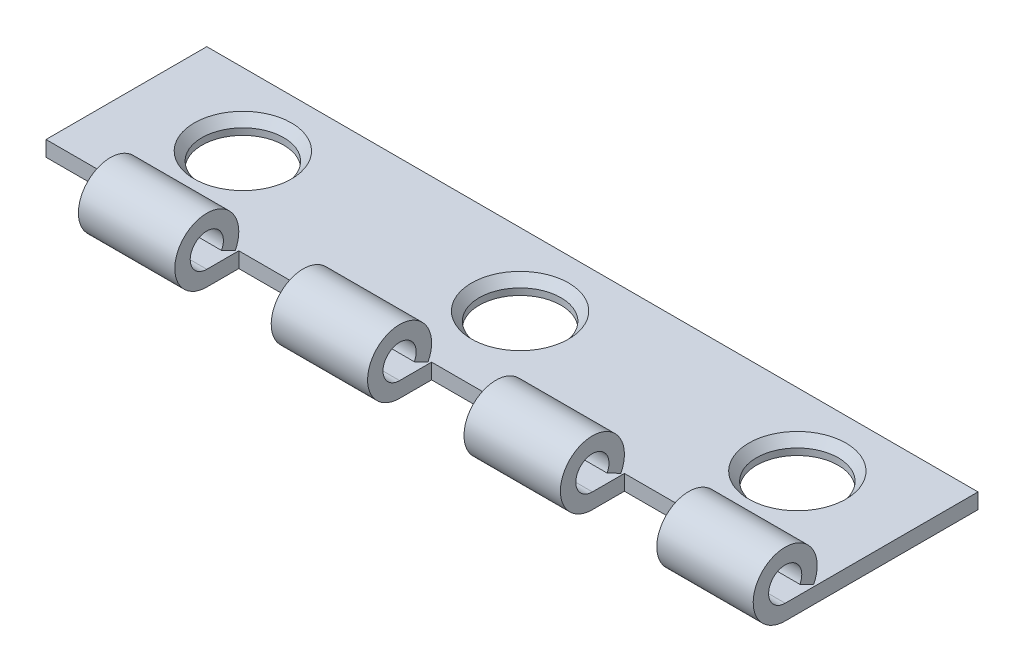
ISO-10303-21;
HEADER;
FILE_DESCRIPTION(('STEP AP214'),'2;1');
FILE_NAME('part.step','',(''),(''),'','','');
FILE_SCHEMA(('AUTOMOTIVE_DESIGN { 1 0 10303 214 1 1 1 1 }'));
ENDSEC;
DATA;
#1=APPLICATION_CONTEXT('core data for automotive mechanical design processes');
#2=APPLICATION_PROTOCOL_DEFINITION('international standard','automotive_design',2000,#1);
#3=PRODUCT_CONTEXT('',#1,'mechanical');
#4=PRODUCT('Part','Part','',(#3));
#5=PRODUCT_RELATED_PRODUCT_CATEGORY('part','',(#4));
#6=PRODUCT_DEFINITION_FORMATION('','',#4);
#7=PRODUCT_DEFINITION_CONTEXT('part definition',#1,'design');
#8=PRODUCT_DEFINITION('design','',#6,#7);
#9=PRODUCT_DEFINITION_SHAPE('','',#8);
#10=(LENGTH_UNIT() NAMED_UNIT(*) SI_UNIT(.MILLI.,.METRE.));
#11=(NAMED_UNIT(*) PLANE_ANGLE_UNIT() SI_UNIT($,.RADIAN.));
#12=(NAMED_UNIT(*) SI_UNIT($,.STERADIAN.) SOLID_ANGLE_UNIT());
#13=UNCERTAINTY_MEASURE_WITH_UNIT(LENGTH_MEASURE(1.E-05),#10,'distance_accuracy_value','');
#14=(GEOMETRIC_REPRESENTATION_CONTEXT(3) GLOBAL_UNCERTAINTY_ASSIGNED_CONTEXT((#13)) GLOBAL_UNIT_ASSIGNED_CONTEXT((#10,
#11,#12)) REPRESENTATION_CONTEXT('',''));
#15=CARTESIAN_POINT('',(0.,0.,0.));
#16=DIRECTION('',(0.,0.,1.));
#17=DIRECTION('',(1.,0.,0.));
#18=AXIS2_PLACEMENT_3D('',#15,#16,#17);
#19=CARTESIAN_POINT('',(-25.4,0.,0.));
#20=DIRECTION('',(1.,0.,0.));
#21=DIRECTION('',(0.,0.,-1.));
#22=AXIS2_PLACEMENT_3D('',#19,#20,#21);
#23=CYLINDRICAL_SURFACE('',#22,1.0922);
#24=DIRECTION('',(1.,0.,0.));
#25=VECTOR('',#24,1.);
#26=CARTESIAN_POINT('',(-25.4,-0.502417325814915,-0.969782280061349));
#27=LINE('',#26,#25);
#28=CARTESIAN_POINT('',(-6.35,-0.502417325814915,-0.969782280061349));
#29=VERTEX_POINT('',#28);
#30=CARTESIAN_POINT('',(0.,-0.502417325814915,-0.969782280061349));
#31=VERTEX_POINT('',#30);
#32=EDGE_CURVE('E384',#29,#31,#27,.T.);
#33=ORIENTED_EDGE('',*,*,#32,.T.);
#34=CARTESIAN_POINT('',(0.,0.,0.));
#35=DIRECTION('',(-1.,0.,0.));
#36=DIRECTION('',(0.,0.,1.));
#37=AXIS2_PLACEMENT_3D('',#34,#35,#36);
#38=CIRCLE('',#37,1.0922);
#39=CARTESIAN_POINT('',(0.,-1.0922,0.));
#40=VERTEX_POINT('',#39);
#41=EDGE_CURVE('E316',#31,#40,#38,.F.);
#42=ORIENTED_EDGE('',*,*,#41,.T.);
#43=DIRECTION('',(1.,0.,0.));
#44=VECTOR('',#43,1.);
#45=CARTESIAN_POINT('',(-25.4,-1.0922,0.));
#46=LINE('',#45,#44);
#47=CARTESIAN_POINT('',(-6.35,-1.0922,0.));
#48=VERTEX_POINT('',#47);
#49=EDGE_CURVE('E403',#48,#40,#46,.T.);
#50=ORIENTED_EDGE('',*,*,#49,.F.);
#51=CARTESIAN_POINT('',(-6.35,0.,0.));
#52=DIRECTION('',(1.,0.,0.));
#53=DIRECTION('',(0.,0.,-1.));
#54=AXIS2_PLACEMENT_3D('',#51,#52,#53);
#55=CIRCLE('',#54,1.0922);
#56=EDGE_CURVE('E280',#48,#29,#55,.F.);
#57=ORIENTED_EDGE('',*,*,#56,.T.);
#58=EDGE_LOOP('',(#33,#42,#50,#57));
#59=FACE_BOUND('',#58,.T.);
#60=ADVANCED_FACE('F41',(#59),#23,.F.);
#61=CARTESIAN_POINT('',(-19.05,-0.502417325814915,-0.969782280061349));
#62=VERTEX_POINT('',#61);
#63=CARTESIAN_POINT('',(-12.7,-0.502417325814915,-0.969782280061349));
#64=VERTEX_POINT('',#63);
#65=EDGE_CURVE('E482',#62,#64,#27,.T.);
#66=ORIENTED_EDGE('',*,*,#65,.T.);
#67=CARTESIAN_POINT('',(-12.7,0.,0.));
#68=DIRECTION('',(-1.,0.,0.));
#69=DIRECTION('',(0.,0.,1.));
#70=AXIS2_PLACEMENT_3D('',#67,#68,#69);
#71=CIRCLE('',#70,1.0922);
#72=CARTESIAN_POINT('',(-12.7,-1.0922,0.));
#73=VERTEX_POINT('',#72);
#74=EDGE_CURVE('E294',#64,#73,#71,.F.);
#75=ORIENTED_EDGE('',*,*,#74,.T.);
#76=CARTESIAN_POINT('',(-19.05,-1.0922,0.));
#77=VERTEX_POINT('',#76);
#78=EDGE_CURVE('E408',#77,#73,#46,.T.);
#79=ORIENTED_EDGE('',*,*,#78,.F.);
#80=CARTESIAN_POINT('',(-19.05,0.,0.));
#81=DIRECTION('',(1.,0.,0.));
#82=DIRECTION('',(0.,0.,-1.));
#83=AXIS2_PLACEMENT_3D('',#80,#81,#82);
#84=CIRCLE('',#83,1.0922);
#85=EDGE_CURVE('E269',#77,#62,#84,.F.);
#86=ORIENTED_EDGE('',*,*,#85,.T.);
#87=EDGE_LOOP('',(#66,#75,#79,#86));
#88=FACE_BOUND('',#87,.T.);
#89=ADVANCED_FACE('F508',(#88),#23,.F.);
#90=CARTESIAN_POINT('',(-25.4,0.,0.));
#91=DIRECTION('',(1.,0.,0.));
#92=DIRECTION('',(0.,0.,-1.));
#93=AXIS2_PLACEMENT_3D('',#90,#91,#92);
#94=CYLINDRICAL_SURFACE('',#93,2.10820000000008);
#95=CARTESIAN_POINT('',(0.,0.,0.));
#96=DIRECTION('',(-1.,0.,0.));
#97=DIRECTION('',(0.,0.,1.));
#98=AXIS2_PLACEMENT_3D('',#95,#96,#97);
#99=CIRCLE('',#98,2.10820000000008);
#100=CARTESIAN_POINT('',(0.,-2.1082,0.));
#101=VERTEX_POINT('',#100);
#102=CARTESIAN_POINT('',(0.,-0.969782280061348,-1.87190533128121));
#103=VERTEX_POINT('',#102);
#104=EDGE_CURVE('E230',#101,#103,#99,.T.);
#105=ORIENTED_EDGE('',*,*,#104,.T.);
#106=DIRECTION('',(1.,0.,0.));
#107=VECTOR('',#106,1.);
#108=CARTESIAN_POINT('',(-25.4,-0.969782280061348,-1.87190533128121));
#109=LINE('',#108,#107);
#110=CARTESIAN_POINT('',(-6.35,-0.969782280061348,-1.87190533128121));
#111=VERTEX_POINT('',#110);
#112=EDGE_CURVE('E387',#111,#103,#109,.T.);
#113=ORIENTED_EDGE('',*,*,#112,.F.);
#114=CARTESIAN_POINT('',(-6.35,0.,0.));
#115=DIRECTION('',(1.,0.,0.));
#116=DIRECTION('',(0.,0.,-1.));
#117=AXIS2_PLACEMENT_3D('',#114,#115,#116);
#118=CIRCLE('',#117,2.10820000000008);
#119=CARTESIAN_POINT('',(-6.35,-2.1082,0.));
#120=VERTEX_POINT('',#119);
#121=EDGE_CURVE('E286',#111,#120,#118,.T.);
#122=ORIENTED_EDGE('',*,*,#121,.T.);
#123=DIRECTION('',(1.,0.,0.));
#124=VECTOR('',#123,1.);
#125=CARTESIAN_POINT('',(-25.4,-2.1082,0.));
#126=LINE('',#125,#124);
#127=EDGE_CURVE('E391',#120,#101,#126,.T.);
#128=ORIENTED_EDGE('',*,*,#127,.T.);
#129=EDGE_LOOP('',(#105,#113,#122,#128));
#130=FACE_BOUND('',#129,.T.);
#131=ADVANCED_FACE('F526',(#130),#94,.T.);
#132=CARTESIAN_POINT('',(-12.7,0.,0.));
#133=DIRECTION('',(-1.,0.,0.));
#134=DIRECTION('',(0.,0.,1.));
#135=AXIS2_PLACEMENT_3D('',#132,#133,#134);
#136=CIRCLE('',#135,2.10820000000008);
#137=CARTESIAN_POINT('',(-12.7,-2.1082,0.));
#138=VERTEX_POINT('',#137);
#139=CARTESIAN_POINT('',(-12.7,-0.969782280061348,-1.87190533128121));
#140=VERTEX_POINT('',#139);
#141=EDGE_CURVE('E300',#138,#140,#136,.T.);
#142=ORIENTED_EDGE('',*,*,#141,.T.);
#143=CARTESIAN_POINT('',(-19.05,-0.969782280061348,-1.87190533128121));
#144=VERTEX_POINT('',#143);
#145=EDGE_CURVE('E490',#144,#140,#109,.T.);
#146=ORIENTED_EDGE('',*,*,#145,.F.);
#147=CARTESIAN_POINT('',(-19.05,0.,0.));
#148=DIRECTION('',(1.,0.,0.));
#149=DIRECTION('',(0.,0.,-1.));
#150=AXIS2_PLACEMENT_3D('',#147,#148,#149);
#151=CIRCLE('',#150,2.10820000000008);
#152=CARTESIAN_POINT('',(-19.05,-2.1082,0.));
#153=VERTEX_POINT('',#152);
#154=EDGE_CURVE('E275',#144,#153,#151,.T.);
#155=ORIENTED_EDGE('',*,*,#154,.T.);
#156=EDGE_CURVE('E397',#153,#138,#126,.T.);
#157=ORIENTED_EDGE('',*,*,#156,.T.);
#158=EDGE_LOOP('',(#142,#146,#155,#157));
#159=FACE_BOUND('',#158,.T.);
#160=ADVANCED_FACE('F528',(#159),#94,.T.);
#161=CARTESIAN_POINT('',(6.35,-0.969782280061348,-1.87190533128121));
#162=VERTEX_POINT('',#161);
#163=CARTESIAN_POINT('',(12.7,-0.969782280061348,-1.87190533128121));
#164=VERTEX_POINT('',#163);
#165=EDGE_CURVE('E385',#162,#164,#109,.T.);
#166=ORIENTED_EDGE('',*,*,#165,.F.);
#167=CARTESIAN_POINT('',(6.35,0.,0.));
#168=DIRECTION('',(1.,0.,0.));
#169=DIRECTION('',(0.,0.,-1.));
#170=AXIS2_PLACEMENT_3D('',#167,#168,#169);
#171=CIRCLE('',#170,2.10820000000008);
#172=CARTESIAN_POINT('',(6.35,-2.1082,0.));
#173=VERTEX_POINT('',#172);
#174=EDGE_CURVE('E311',#162,#173,#171,.T.);
#175=ORIENTED_EDGE('',*,*,#174,.T.);
#176=CARTESIAN_POINT('',(12.7,-2.1082,0.));
#177=VERTEX_POINT('',#176);
#178=EDGE_CURVE('E389',#173,#177,#126,.T.);
#179=ORIENTED_EDGE('',*,*,#178,.T.);
#180=CARTESIAN_POINT('',(12.7,0.,0.));
#181=DIRECTION('',(-1.,0.,0.));
#182=DIRECTION('',(0.,0.,1.));
#183=AXIS2_PLACEMENT_3D('',#180,#181,#182);
#184=CIRCLE('',#183,2.10820000000008);
#185=EDGE_CURVE('E347',#177,#164,#184,.T.);
#186=ORIENTED_EDGE('',*,*,#185,.T.);
#187=EDGE_LOOP('',(#166,#175,#179,#186));
#188=FACE_BOUND('',#187,.T.);
#189=ADVANCED_FACE('F578',(#188),#94,.T.);
#190=CARTESIAN_POINT('',(-25.4,-0.502417325814915,-0.969782280061349));
#191=DIRECTION('',(0.,0.887916388995925,-0.460004876226804));
#192=DIRECTION('',(0.,-0.460004876226804,-0.887916388995925));
#193=AXIS2_PLACEMENT_3D('',#190,#191,#192);
#194=PLANE('',#193);
#195=ORIENTED_EDGE('',*,*,#112,.T.);
#196=DIRECTION('',(0.,0.460004876226804,0.887916388995925));
#197=VECTOR('',#196,1.);
#198=CARTESIAN_POINT('',(0.,-0.502417325814915,-0.969782280061349));
#199=LINE('',#198,#197);
#200=EDGE_CURVE('E319',#103,#31,#199,.T.);
#201=ORIENTED_EDGE('',*,*,#200,.T.);
#202=ORIENTED_EDGE('',*,*,#32,.F.);
#203=DIRECTION('',(0.,-0.460004876226804,-0.887916388995925));
#204=VECTOR('',#203,1.);
#205=CARTESIAN_POINT('',(-6.35,-0.502417325814915,-0.969782280061349));
#206=LINE('',#205,#204);
#207=EDGE_CURVE('E283',#29,#111,#206,.T.);
#208=ORIENTED_EDGE('',*,*,#207,.T.);
#209=EDGE_LOOP('',(#195,#201,#202,#208));
#210=FACE_BOUND('',#209,.T.);
#211=ADVANCED_FACE('F523',(#210),#194,.F.);
#212=ORIENTED_EDGE('',*,*,#145,.T.);
#213=DIRECTION('',(0.,0.460004876226804,0.887916388995925));
#214=VECTOR('',#213,1.);
#215=CARTESIAN_POINT('',(-12.7,-0.502417325814915,-0.969782280061349));
#216=LINE('',#215,#214);
#217=EDGE_CURVE('E297',#140,#64,#216,.T.);
#218=ORIENTED_EDGE('',*,*,#217,.T.);
#219=ORIENTED_EDGE('',*,*,#65,.F.);
#220=DIRECTION('',(0.,-0.460004876226804,-0.887916388995925));
#221=VECTOR('',#220,1.);
#222=CARTESIAN_POINT('',(-19.05,-0.502417325814915,-0.969782280061349));
#223=LINE('',#222,#221);
#224=EDGE_CURVE('E272',#62,#144,#223,.T.);
#225=ORIENTED_EDGE('',*,*,#224,.T.);
#226=EDGE_LOOP('',(#212,#218,#219,#225));
#227=FACE_BOUND('',#226,.T.);
#228=ADVANCED_FACE('F516',(#227),#194,.F.);
#229=CARTESIAN_POINT('',(6.35,-1.0922,0.));
#230=VERTEX_POINT('',#229);
#231=CARTESIAN_POINT('',(12.7,-1.0922,0.));
#232=VERTEX_POINT('',#231);
#233=EDGE_CURVE('E401',#230,#232,#46,.T.);
#234=ORIENTED_EDGE('',*,*,#233,.F.);
#235=CARTESIAN_POINT('',(6.35,0.,0.));
#236=DIRECTION('',(1.,0.,0.));
#237=DIRECTION('',(0.,0.,-1.));
#238=AXIS2_PLACEMENT_3D('',#235,#236,#237);
#239=CIRCLE('',#238,1.0922);
#240=CARTESIAN_POINT('',(6.35,-0.502417325814915,-0.969782280061349));
#241=VERTEX_POINT('',#240);
#242=EDGE_CURVE('E305',#230,#241,#239,.F.);
#243=ORIENTED_EDGE('',*,*,#242,.T.);
#244=CARTESIAN_POINT('',(12.7,-0.502417325814915,-0.969782280061349));
#245=VERTEX_POINT('',#244);
#246=EDGE_CURVE('E382',#241,#245,#27,.T.);
#247=ORIENTED_EDGE('',*,*,#246,.T.);
#248=CARTESIAN_POINT('',(12.7,0.,0.));
#249=DIRECTION('',(-1.,0.,0.));
#250=DIRECTION('',(0.,0.,1.));
#251=AXIS2_PLACEMENT_3D('',#248,#249,#250);
#252=CIRCLE('',#251,1.0922);
#253=EDGE_CURVE('E346',#245,#232,#252,.F.);
#254=ORIENTED_EDGE('',*,*,#253,.T.);
#255=EDGE_LOOP('',(#234,#243,#247,#254));
#256=FACE_BOUND('',#255,.T.);
#257=ADVANCED_FACE('F547',(#256),#23,.F.);
#258=ORIENTED_EDGE('',*,*,#246,.F.);
#259=DIRECTION('',(0.,-0.460004876226804,-0.887916388995925));
#260=VECTOR('',#259,1.);
#261=CARTESIAN_POINT('',(6.35,-0.502417325814915,-0.969782280061349));
#262=LINE('',#261,#260);
#263=EDGE_CURVE('E308',#241,#162,#262,.T.);
#264=ORIENTED_EDGE('',*,*,#263,.T.);
#265=ORIENTED_EDGE('',*,*,#165,.T.);
#266=DIRECTION('',(0.,0.460004876226804,0.887916388995925));
#267=VECTOR('',#266,1.);
#268=CARTESIAN_POINT('',(12.7,-0.502417325814915,-0.969782280061349));
#269=LINE('',#268,#267);
#270=EDGE_CURVE('E407',#164,#245,#269,.T.);
#271=ORIENTED_EDGE('',*,*,#270,.T.);
#272=EDGE_LOOP('',(#258,#264,#265,#271));
#273=FACE_BOUND('',#272,.T.);
#274=ADVANCED_FACE('F549',(#273),#194,.F.);
#275=CARTESIAN_POINT('',(19.05,-1.0922,0.));
#276=VERTEX_POINT('',#275);
#277=CARTESIAN_POINT('',(25.4,-1.0922,0.));
#278=VERTEX_POINT('',#277);
#279=EDGE_CURVE('E400',#276,#278,#46,.T.);
#280=ORIENTED_EDGE('',*,*,#279,.F.);
#281=CARTESIAN_POINT('',(19.05,0.,0.));
#282=DIRECTION('',(1.,0.,0.));
#283=DIRECTION('',(0.,0.,-1.));
#284=AXIS2_PLACEMENT_3D('',#281,#282,#283);
#285=CIRCLE('',#284,1.0922);
#286=CARTESIAN_POINT('',(19.05,-0.502417325814915,-0.969782280061349));
#287=VERTEX_POINT('',#286);
#288=EDGE_CURVE('E336',#276,#287,#285,.F.);
#289=ORIENTED_EDGE('',*,*,#288,.T.);
#290=CARTESIAN_POINT('',(25.4,-0.502417325814915,-0.969782280061349));
#291=VERTEX_POINT('',#290);
#292=EDGE_CURVE('E367',#287,#291,#27,.T.);
#293=ORIENTED_EDGE('',*,*,#292,.T.);
#294=CARTESIAN_POINT('',(25.4,0.,0.));
#295=DIRECTION('',(1.,0.,0.));
#296=DIRECTION('',(0.,0.,-1.));
#297=AXIS2_PLACEMENT_3D('',#294,#295,#296);
#298=CIRCLE('',#297,1.0922);
#299=EDGE_CURVE('E358',#291,#278,#298,.T.);
#300=ORIENTED_EDGE('',*,*,#299,.T.);
#301=EDGE_LOOP('',(#280,#289,#293,#300));
#302=FACE_BOUND('',#301,.T.);
#303=ADVANCED_FACE('F43',(#302),#23,.F.);
#304=CARTESIAN_POINT('',(-25.4,-1.09219999999999,-12.7));
#305=DIRECTION('',(0.,-1.,0.));
#306=DIRECTION('',(0.,0.,1.));
#307=AXIS2_PLACEMENT_3D('',#304,#305,#306);
#308=PLANE('',#307);
#309=CARTESIAN_POINT('',(-18.2626,-1.0922,-7.9375));
#310=DIRECTION('',(0.,1.,0.));
#311=DIRECTION('',(0.,0.,-1.));
#312=AXIS2_PLACEMENT_3D('',#309,#310,#311);
#313=CIRCLE('',#312,3.2004);
#314=CARTESIAN_POINT('',(-18.2626,-1.09219999999999,-11.1379));
#315=VERTEX_POINT('',#314);
#316=EDGE_CURVE('E256',#315,#315,#313,.T.);
#317=ORIENTED_EDGE('',*,*,#316,.F.);
#318=EDGE_LOOP('',(#317));
#319=FACE_BOUND('',#318,.T.);
#320=CARTESIAN_POINT('',(0.,-1.0922,-7.9375));
#321=DIRECTION('',(0.,1.,0.));
#322=DIRECTION('',(0.,0.,-1.));
#323=AXIS2_PLACEMENT_3D('',#320,#321,#322);
#324=CIRCLE('',#323,3.2004);
#325=CARTESIAN_POINT('',(0.,-1.09219999999999,-11.1379));
#326=VERTEX_POINT('',#325);
#327=EDGE_CURVE('E425',#326,#326,#324,.T.);
#328=ORIENTED_EDGE('',*,*,#327,.F.);
#329=EDGE_LOOP('',(#328));
#330=FACE_BOUND('',#329,.T.);
#331=CARTESIAN_POINT('',(18.2626,-1.0922,-7.9375));
#332=DIRECTION('',(0.,1.,0.));
#333=DIRECTION('',(0.,0.,-1.));
#334=AXIS2_PLACEMENT_3D('',#331,#332,#333);
#335=CIRCLE('',#334,3.2004);
#336=CARTESIAN_POINT('',(18.2626,-1.09219999999999,-11.1379));
#337=VERTEX_POINT('',#336);
#338=EDGE_CURVE('E421',#337,#337,#335,.T.);
#339=ORIENTED_EDGE('',*,*,#338,.F.);
#340=EDGE_LOOP('',(#339));
#341=FACE_BOUND('',#340,.T.);
#342=ORIENTED_EDGE('',*,*,#49,.T.);
#343=DIRECTION('',(0.,0.,-1.));
#344=VECTOR('',#343,1.);
#345=CARTESIAN_POINT('',(0.,-1.09219999999999,-12.7));
#346=LINE('',#345,#344);
#347=CARTESIAN_POINT('',(0.,-1.0922,-2.10820000000012));
#348=VERTEX_POINT('',#347);
#349=EDGE_CURVE('E314',#40,#348,#346,.T.);
#350=ORIENTED_EDGE('',*,*,#349,.T.);
#351=DIRECTION('',(1.,0.,0.));
#352=VECTOR('',#351,1.);
#353=CARTESIAN_POINT('',(-25.4,-1.0922,-2.10820000000012));
#354=LINE('',#353,#352);
#355=CARTESIAN_POINT('',(6.35,-1.0922,-2.10820000000012));
#356=VERTEX_POINT('',#355);
#357=EDGE_CURVE('E220',#348,#356,#354,.T.);
#358=ORIENTED_EDGE('',*,*,#357,.T.);
#359=DIRECTION('',(0.,0.,1.));
#360=VECTOR('',#359,1.);
#361=CARTESIAN_POINT('',(6.35,-1.09219999999999,-12.7));
#362=LINE('',#361,#360);
#363=EDGE_CURVE('E302',#356,#230,#362,.T.);
#364=ORIENTED_EDGE('',*,*,#363,.T.);
#365=ORIENTED_EDGE('',*,*,#233,.T.);
#366=DIRECTION('',(0.,0.,-1.));
#367=VECTOR('',#366,1.);
#368=CARTESIAN_POINT('',(12.7,-1.09219999999999,-12.7));
#369=LINE('',#368,#367);
#370=CARTESIAN_POINT('',(12.7,-1.0922,-2.10820000000012));
#371=VERTEX_POINT('',#370);
#372=EDGE_CURVE('E350',#232,#371,#369,.T.);
#373=ORIENTED_EDGE('',*,*,#372,.T.);
#374=DIRECTION('',(1.,0.,0.));
#375=VECTOR('',#374,1.);
#376=CARTESIAN_POINT('',(-25.4,-1.0922,-2.10820000000011));
#377=LINE('',#376,#375);
#378=CARTESIAN_POINT('',(19.05,-1.0922,-2.10820000000012));
#379=VERTEX_POINT('',#378);
#380=EDGE_CURVE('E355',#371,#379,#377,.T.);
#381=ORIENTED_EDGE('',*,*,#380,.T.);
#382=DIRECTION('',(0.,0.,1.));
#383=VECTOR('',#382,1.);
#384=CARTESIAN_POINT('',(19.05,-1.09219999999999,-12.7));
#385=LINE('',#384,#383);
#386=EDGE_CURVE('E341',#379,#276,#385,.T.);
#387=ORIENTED_EDGE('',*,*,#386,.T.);
#388=ORIENTED_EDGE('',*,*,#279,.T.);
#389=DIRECTION('',(0.,0.,-1.));
#390=VECTOR('',#389,1.);
#391=CARTESIAN_POINT('',(25.4,-1.09219999999999,-12.7));
#392=LINE('',#391,#390);
#393=CARTESIAN_POINT('',(25.4,-1.09219999999999,-12.7));
#394=VERTEX_POINT('',#393);
#395=EDGE_CURVE('E370',#278,#394,#392,.T.);
#396=ORIENTED_EDGE('',*,*,#395,.T.);
#397=DIRECTION('',(1.,0.,0.));
#398=VECTOR('',#397,1.);
#399=CARTESIAN_POINT('',(-25.4,-1.09219999999999,-12.7));
#400=LINE('',#399,#398);
#401=CARTESIAN_POINT('',(-25.4,-1.09219999999999,-12.7));
#402=VERTEX_POINT('',#401);
#403=EDGE_CURVE('E396',#402,#394,#400,.T.);
#404=ORIENTED_EDGE('',*,*,#403,.F.);
#405=DIRECTION('',(0.,0.,-1.));
#406=VECTOR('',#405,1.);
#407=CARTESIAN_POINT('',(-25.4,-1.09219999999999,-12.7));
#408=LINE('',#407,#406);
#409=CARTESIAN_POINT('',(-25.4,-1.0922,-2.10820000000012));
#410=VERTEX_POINT('',#409);
#411=EDGE_CURVE('E359',#410,#402,#408,.T.);
#412=ORIENTED_EDGE('',*,*,#411,.F.);
#413=DIRECTION('',(1.,0.,0.));
#414=VECTOR('',#413,1.);
#415=CARTESIAN_POINT('',(-25.4,-1.0922,-2.10820000000012));
#416=LINE('',#415,#414);
#417=CARTESIAN_POINT('',(-19.05,-1.0922,-2.10820000000012));
#418=VERTEX_POINT('',#417);
#419=EDGE_CURVE('E223',#410,#418,#416,.T.);
#420=ORIENTED_EDGE('',*,*,#419,.T.);
#421=DIRECTION('',(0.,0.,1.));
#422=VECTOR('',#421,1.);
#423=CARTESIAN_POINT('',(-19.05,-1.09219999999999,-12.7));
#424=LINE('',#423,#422);
#425=EDGE_CURVE('E266',#418,#77,#424,.T.);
#426=ORIENTED_EDGE('',*,*,#425,.T.);
#427=ORIENTED_EDGE('',*,*,#78,.T.);
#428=DIRECTION('',(0.,0.,-1.));
#429=VECTOR('',#428,1.);
#430=CARTESIAN_POINT('',(-12.7,-1.09219999999999,-12.7));
#431=LINE('',#430,#429);
#432=CARTESIAN_POINT('',(-12.7,-1.0922,-2.10820000000012));
#433=VERTEX_POINT('',#432);
#434=EDGE_CURVE('E291',#73,#433,#431,.T.);
#435=ORIENTED_EDGE('',*,*,#434,.T.);
#436=DIRECTION('',(1.,0.,0.));
#437=VECTOR('',#436,1.);
#438=CARTESIAN_POINT('',(-25.4,-1.0922,-2.10820000000012));
#439=LINE('',#438,#437);
#440=CARTESIAN_POINT('',(-6.35,-1.0922,-2.10820000000012));
#441=VERTEX_POINT('',#440);
#442=EDGE_CURVE('E288',#433,#441,#439,.T.);
#443=ORIENTED_EDGE('',*,*,#442,.T.);
#444=DIRECTION('',(0.,0.,1.));
#445=VECTOR('',#444,1.);
#446=CARTESIAN_POINT('',(-6.35,-1.09219999999999,-12.7));
#447=LINE('',#446,#445);
#448=EDGE_CURVE('E277',#441,#48,#447,.T.);
#449=ORIENTED_EDGE('',*,*,#448,.T.);
#450=EDGE_LOOP('',(#342,#350,#358,#364,#365,#373,#381,#387,#388,#396,#404,#412,#420,#426,#427,
#435,#443,#449));
#451=FACE_BOUND('',#450,.T.);
#452=ADVANCED_FACE('F458',(#319,#330,#341,#451),#308,.F.);
#453=CARTESIAN_POINT('',(-25.4,-2.10819999999999,-12.7));
#454=DIRECTION('',(0.,0.,1.));
#455=DIRECTION('',(1.,0.,0.));
#456=AXIS2_PLACEMENT_3D('',#453,#454,#455);
#457=PLANE('',#456);
#458=DIRECTION('',(0.,-1.,0.));
#459=VECTOR('',#458,1.);
#460=CARTESIAN_POINT('',(25.4,-2.10819999999999,-12.7));
#461=LINE('',#460,#459);
#462=CARTESIAN_POINT('',(25.4,-2.10819999999999,-12.7));
#463=VERTEX_POINT('',#462);
#464=EDGE_CURVE('E372',#394,#463,#461,.T.);
#465=ORIENTED_EDGE('',*,*,#464,.T.);
#466=DIRECTION('',(1.,0.,0.));
#467=VECTOR('',#466,1.);
#468=CARTESIAN_POINT('',(-25.4,-2.10819999999999,-12.7));
#469=LINE('',#468,#467);
#470=CARTESIAN_POINT('',(-25.4,-2.10819999999999,-12.7));
#471=VERTEX_POINT('',#470);
#472=EDGE_CURVE('E393',#471,#463,#469,.T.);
#473=ORIENTED_EDGE('',*,*,#472,.F.);
#474=DIRECTION('',(0.,-1.,0.));
#475=VECTOR('',#474,1.);
#476=CARTESIAN_POINT('',(-25.4,-2.10819999999999,-12.7));
#477=LINE('',#476,#475);
#478=EDGE_CURVE('E361',#402,#471,#477,.T.);
#479=ORIENTED_EDGE('',*,*,#478,.F.);
#480=ORIENTED_EDGE('',*,*,#403,.T.);
#481=EDGE_LOOP('',(#465,#473,#479,#480));
#482=FACE_BOUND('',#481,.T.);
#483=ADVANCED_FACE('F461',(#482),#457,.F.);
#484=CARTESIAN_POINT('',(-25.4,-2.1082,0.));
#485=DIRECTION('',(0.,1.,0.));
#486=DIRECTION('',(0.,0.,-1.));
#487=AXIS2_PLACEMENT_3D('',#484,#485,#486);
#488=PLANE('',#487);
#489=CARTESIAN_POINT('',(-18.2626,-2.1082,-7.9375));
#490=DIRECTION('',(0.,1.,0.));
#491=DIRECTION('',(0.,0.,-1.));
#492=AXIS2_PLACEMENT_3D('',#489,#490,#491);
#493=CIRCLE('',#492,2.6924);
#494=CARTESIAN_POINT('',(-18.2626,-2.1082,-10.6299));
#495=VERTEX_POINT('',#494);
#496=EDGE_CURVE('E416',#495,#495,#493,.T.);
#497=ORIENTED_EDGE('',*,*,#496,.T.);
#498=EDGE_LOOP('',(#497));
#499=FACE_BOUND('',#498,.T.);
#500=CARTESIAN_POINT('',(0.,-2.1082,-7.9375));
#501=DIRECTION('',(0.,1.,0.));
#502=DIRECTION('',(0.,0.,-1.));
#503=AXIS2_PLACEMENT_3D('',#500,#501,#502);
#504=CIRCLE('',#503,2.6924);
#505=CARTESIAN_POINT('',(0.,-2.1082,-10.6299));
#506=VERTEX_POINT('',#505);
#507=EDGE_CURVE('E436',#506,#506,#504,.T.);
#508=ORIENTED_EDGE('',*,*,#507,.T.);
#509=EDGE_LOOP('',(#508));
#510=FACE_BOUND('',#509,.T.);
#511=CARTESIAN_POINT('',(18.2626,-2.1082,-7.93750000000001));
#512=DIRECTION('',(0.,1.,0.));
#513=DIRECTION('',(0.,0.,-1.));
#514=AXIS2_PLACEMENT_3D('',#511,#512,#513);
#515=CIRCLE('',#514,2.6924);
#516=CARTESIAN_POINT('',(18.2626,-2.1082,-10.6299));
#517=VERTEX_POINT('',#516);
#518=EDGE_CURVE('E433',#517,#517,#515,.T.);
#519=ORIENTED_EDGE('',*,*,#518,.T.);
#520=EDGE_LOOP('',(#519));
#521=FACE_BOUND('',#520,.T.);
#522=DIRECTION('',(-1.,0.,0.));
#523=VECTOR('',#522,1.);
#524=CARTESIAN_POINT('',(0.,-2.1082,-2.10820000000012));
#525=LINE('',#524,#523);
#526=CARTESIAN_POINT('',(6.35,-2.1082,-2.10820000000012));
#527=VERTEX_POINT('',#526);
#528=CARTESIAN_POINT('',(0.,-2.1082,-2.10820000000012));
#529=VERTEX_POINT('',#528);
#530=EDGE_CURVE('E58',#527,#529,#525,.T.);
#531=ORIENTED_EDGE('',*,*,#530,.T.);
#532=DIRECTION('',(0.,0.,1.));
#533=VECTOR('',#532,1.);
#534=CARTESIAN_POINT('',(0.,-2.1082,2.10820000000012));
#535=LINE('',#534,#533);
#536=EDGE_CURVE('E227',#529,#101,#535,.T.);
#537=ORIENTED_EDGE('',*,*,#536,.T.);
#538=ORIENTED_EDGE('',*,*,#127,.F.);
#539=DIRECTION('',(0.,0.,-1.));
#540=VECTOR('',#539,1.);
#541=CARTESIAN_POINT('',(-6.35,-2.1082,0.));
#542=LINE('',#541,#540);
#543=CARTESIAN_POINT('',(-6.35,-2.1082,-2.10820000000012));
#544=VERTEX_POINT('',#543);
#545=EDGE_CURVE('E50',#120,#544,#542,.T.);
#546=ORIENTED_EDGE('',*,*,#545,.T.);
#547=DIRECTION('',(-1.,0.,0.));
#548=VECTOR('',#547,1.);
#549=CARTESIAN_POINT('',(-12.7,-2.1082,-2.10820000000012));
#550=LINE('',#549,#548);
#551=CARTESIAN_POINT('',(-12.7,-2.1082,-2.10820000000012));
#552=VERTEX_POINT('',#551);
#553=EDGE_CURVE('E66',#544,#552,#550,.T.);
#554=ORIENTED_EDGE('',*,*,#553,.T.);
#555=DIRECTION('',(0.,0.,1.));
#556=VECTOR('',#555,1.);
#557=CARTESIAN_POINT('',(-12.7,-2.1082,2.10820000000012));
#558=LINE('',#557,#556);
#559=EDGE_CURVE('E243',#552,#138,#558,.T.);
#560=ORIENTED_EDGE('',*,*,#559,.T.);
#561=ORIENTED_EDGE('',*,*,#156,.F.);
#562=DIRECTION('',(0.,0.,-1.));
#563=VECTOR('',#562,1.);
#564=CARTESIAN_POINT('',(-19.05,-2.1082,-2.10820000000012));
#565=LINE('',#564,#563);
#566=CARTESIAN_POINT('',(-19.05,-2.1082,-2.10820000000012));
#567=VERTEX_POINT('',#566);
#568=EDGE_CURVE('E252',#153,#567,#565,.T.);
#569=ORIENTED_EDGE('',*,*,#568,.T.);
#570=DIRECTION('',(-1.,0.,0.));
#571=VECTOR('',#570,1.);
#572=CARTESIAN_POINT('',(-25.4,-2.1082,-2.10820000000012));
#573=LINE('',#572,#571);
#574=CARTESIAN_POINT('',(-25.4,-2.1082,-2.10820000000012));
#575=VERTEX_POINT('',#574);
#576=EDGE_CURVE('E255',#567,#575,#573,.T.);
#577=ORIENTED_EDGE('',*,*,#576,.T.);
#578=DIRECTION('',(0.,0.,1.));
#579=VECTOR('',#578,1.);
#580=CARTESIAN_POINT('',(-25.4,-2.1082,0.));
#581=LINE('',#580,#579);
#582=EDGE_CURVE('E364',#471,#575,#581,.T.);
#583=ORIENTED_EDGE('',*,*,#582,.F.);
#584=ORIENTED_EDGE('',*,*,#472,.T.);
#585=DIRECTION('',(0.,0.,1.));
#586=VECTOR('',#585,1.);
#587=CARTESIAN_POINT('',(25.4,-2.1082,0.));
#588=LINE('',#587,#586);
#589=CARTESIAN_POINT('',(25.4,-2.1082,0.));
#590=VERTEX_POINT('',#589);
#591=EDGE_CURVE('E374',#463,#590,#588,.T.);
#592=ORIENTED_EDGE('',*,*,#591,.T.);
#593=CARTESIAN_POINT('',(19.05,-2.1082,0.));
#594=VERTEX_POINT('',#593);
#595=EDGE_CURVE('E392',#594,#590,#126,.T.);
#596=ORIENTED_EDGE('',*,*,#595,.F.);
#597=DIRECTION('',(0.,0.,-1.));
#598=VECTOR('',#597,1.);
#599=CARTESIAN_POINT('',(19.05,-2.1082,-2.10820000000012));
#600=LINE('',#599,#598);
#601=CARTESIAN_POINT('',(19.05,-2.1082,-2.10820000000012));
#602=VERTEX_POINT('',#601);
#603=EDGE_CURVE('E326',#594,#602,#600,.T.);
#604=ORIENTED_EDGE('',*,*,#603,.T.);
#605=DIRECTION('',(-1.,0.,0.));
#606=VECTOR('',#605,1.);
#607=CARTESIAN_POINT('',(12.7,-2.1082,-2.10820000000012));
#608=LINE('',#607,#606);
#609=CARTESIAN_POINT('',(12.7,-2.1082,-2.10820000000012));
#610=VERTEX_POINT('',#609);
#611=EDGE_CURVE('E329',#602,#610,#608,.T.);
#612=ORIENTED_EDGE('',*,*,#611,.T.);
#613=DIRECTION('',(0.,0.,1.));
#614=VECTOR('',#613,1.);
#615=CARTESIAN_POINT('',(12.7,-2.1082,2.10820000000012));
#616=LINE('',#615,#614);
#617=EDGE_CURVE('E323',#610,#177,#616,.T.);
#618=ORIENTED_EDGE('',*,*,#617,.T.);
#619=ORIENTED_EDGE('',*,*,#178,.F.);
#620=DIRECTION('',(0.,0.,-1.));
#621=VECTOR('',#620,1.);
#622=CARTESIAN_POINT('',(6.35,-2.1082,0.));
#623=LINE('',#622,#621);
#624=EDGE_CURVE('E11',#173,#527,#623,.T.);
#625=ORIENTED_EDGE('',*,*,#624,.T.);
#626=EDGE_LOOP('',(#531,#537,#538,#546,#554,#560,#561,#569,#577,#583,#584,#592,#596,#604,#612,
#618,#619,#625));
#627=FACE_BOUND('',#626,.T.);
#628=ADVANCED_FACE('F236',(#499,#510,#521,#627),#488,.F.);
#629=CARTESIAN_POINT('',(19.05,-0.969782280061348,-1.87190533128121));
#630=VERTEX_POINT('',#629);
#631=CARTESIAN_POINT('',(25.4,-0.969782280061348,-1.87190533128121));
#632=VERTEX_POINT('',#631);
#633=EDGE_CURVE('E388',#630,#632,#109,.T.);
#634=ORIENTED_EDGE('',*,*,#633,.F.);
#635=CARTESIAN_POINT('',(19.05,0.,0.));
#636=DIRECTION('',(1.,0.,0.));
#637=DIRECTION('',(0.,0.,-1.));
#638=AXIS2_PLACEMENT_3D('',#635,#636,#637);
#639=CIRCLE('',#638,2.10820000000008);
#640=EDGE_CURVE('E339',#630,#594,#639,.T.);
#641=ORIENTED_EDGE('',*,*,#640,.T.);
#642=ORIENTED_EDGE('',*,*,#595,.T.);
#643=CARTESIAN_POINT('',(25.4,0.,0.));
#644=DIRECTION('',(-1.,0.,0.));
#645=DIRECTION('',(0.,0.,-1.));
#646=AXIS2_PLACEMENT_3D('',#643,#644,#645);
#647=CIRCLE('',#646,2.10820000000008);
#648=EDGE_CURVE('E377',#590,#632,#647,.T.);
#649=ORIENTED_EDGE('',*,*,#648,.T.);
#650=EDGE_LOOP('',(#634,#641,#642,#649));
#651=FACE_BOUND('',#650,.T.);
#652=ADVANCED_FACE('F487',(#651),#94,.T.);
#653=ORIENTED_EDGE('',*,*,#292,.F.);
#654=DIRECTION('',(0.,-0.460004876226804,-0.887916388995925));
#655=VECTOR('',#654,1.);
#656=CARTESIAN_POINT('',(19.05,-0.502417325814915,-0.969782280061349));
#657=LINE('',#656,#655);
#658=EDGE_CURVE('E404',#287,#630,#657,.T.);
#659=ORIENTED_EDGE('',*,*,#658,.T.);
#660=ORIENTED_EDGE('',*,*,#633,.T.);
#661=DIRECTION('',(0.,0.460004876226804,0.887916388995925));
#662=VECTOR('',#661,1.);
#663=CARTESIAN_POINT('',(25.4,-0.502417325814915,-0.969782280061349));
#664=LINE('',#663,#662);
#665=EDGE_CURVE('E362',#632,#291,#664,.T.);
#666=ORIENTED_EDGE('',*,*,#665,.T.);
#667=EDGE_LOOP('',(#653,#659,#660,#666));
#668=FACE_BOUND('',#667,.T.);
#669=ADVANCED_FACE('F483',(#668),#194,.F.);
#670=CARTESIAN_POINT('',(-25.4,0.,0.));
#671=DIRECTION('',(1.,0.,0.));
#672=DIRECTION('',(0.,0.,-1.));
#673=AXIS2_PLACEMENT_3D('',#670,#671,#672);
#674=PLANE('',#673);
#675=ORIENTED_EDGE('',*,*,#582,.T.);
#676=DIRECTION('',(0.,1.,0.));
#677=VECTOR('',#676,1.);
#678=CARTESIAN_POINT('',(-25.4,-2.1082,-2.10820000000012));
#679=LINE('',#678,#677);
#680=EDGE_CURVE('E246',#575,#410,#679,.T.);
#681=ORIENTED_EDGE('',*,*,#680,.T.);
#682=ORIENTED_EDGE('',*,*,#411,.T.);
#683=ORIENTED_EDGE('',*,*,#478,.T.);
#684=EDGE_LOOP('',(#675,#681,#682,#683));
#685=FACE_BOUND('',#684,.T.);
#686=ADVANCED_FACE('F497',(#685),#674,.F.);
#687=CARTESIAN_POINT('',(25.4,0.,0.));
#688=DIRECTION('',(1.,0.,0.));
#689=DIRECTION('',(0.,0.,-1.));
#690=AXIS2_PLACEMENT_3D('',#687,#688,#689);
#691=PLANE('',#690);
#692=ORIENTED_EDGE('',*,*,#299,.F.);
#693=ORIENTED_EDGE('',*,*,#665,.F.);
#694=ORIENTED_EDGE('',*,*,#648,.F.);
#695=ORIENTED_EDGE('',*,*,#591,.F.);
#696=ORIENTED_EDGE('',*,*,#464,.F.);
#697=ORIENTED_EDGE('',*,*,#395,.F.);
#698=EDGE_LOOP('',(#692,#693,#694,#695,#696,#697));
#699=FACE_BOUND('',#698,.T.);
#700=ADVANCED_FACE('F477',(#699),#691,.T.);
#701=CARTESIAN_POINT('',(12.7,-2.1082,-2.10820000000012));
#702=DIRECTION('',(0.,0.,-1.));
#703=DIRECTION('',(-1.,0.,0.));
#704=AXIS2_PLACEMENT_3D('',#701,#702,#703);
#705=PLANE('',#704);
#706=DIRECTION('',(0.,1.,0.));
#707=VECTOR('',#706,1.);
#708=CARTESIAN_POINT('',(12.7,-2.1082,-2.10820000000012));
#709=LINE('',#708,#707);
#710=EDGE_CURVE('E333',#610,#371,#709,.T.);
#711=ORIENTED_EDGE('',*,*,#710,.F.);
#712=ORIENTED_EDGE('',*,*,#611,.F.);
#713=DIRECTION('',(0.,1.,0.));
#714=VECTOR('',#713,1.);
#715=CARTESIAN_POINT('',(19.05,-2.1082,-2.10820000000012));
#716=LINE('',#715,#714);
#717=EDGE_CURVE('E332',#602,#379,#716,.T.);
#718=ORIENTED_EDGE('',*,*,#717,.T.);
#719=ORIENTED_EDGE('',*,*,#380,.F.);
#720=EDGE_LOOP('',(#711,#712,#718,#719));
#721=FACE_BOUND('',#720,.T.);
#722=ADVANCED_FACE('F573',(#721),#705,.F.);
#723=CARTESIAN_POINT('',(12.7,-2.1082,2.10820000000012));
#724=DIRECTION('',(-1.,0.,0.));
#725=DIRECTION('',(0.,0.,1.));
#726=AXIS2_PLACEMENT_3D('',#723,#724,#725);
#727=PLANE('',#726);
#728=ORIENTED_EDGE('',*,*,#253,.F.);
#729=ORIENTED_EDGE('',*,*,#270,.F.);
#730=ORIENTED_EDGE('',*,*,#185,.F.);
#731=ORIENTED_EDGE('',*,*,#617,.F.);
#732=ORIENTED_EDGE('',*,*,#710,.T.);
#733=ORIENTED_EDGE('',*,*,#372,.F.);
#734=EDGE_LOOP('',(#728,#729,#730,#731,#732,#733));
#735=FACE_BOUND('',#734,.T.);
#736=ADVANCED_FACE('F567',(#735),#727,.F.);
#737=CARTESIAN_POINT('',(19.05,-2.1082,-2.10820000000012));
#738=DIRECTION('',(1.,0.,0.));
#739=DIRECTION('',(0.,0.,-1.));
#740=AXIS2_PLACEMENT_3D('',#737,#738,#739);
#741=PLANE('',#740);
#742=ORIENTED_EDGE('',*,*,#640,.F.);
#743=ORIENTED_EDGE('',*,*,#658,.F.);
#744=ORIENTED_EDGE('',*,*,#288,.F.);
#745=ORIENTED_EDGE('',*,*,#386,.F.);
#746=ORIENTED_EDGE('',*,*,#717,.F.);
#747=ORIENTED_EDGE('',*,*,#603,.F.);
#748=EDGE_LOOP('',(#742,#743,#744,#745,#746,#747));
#749=FACE_BOUND('',#748,.T.);
#750=ADVANCED_FACE('F575',(#749),#741,.F.);
#751=CARTESIAN_POINT('',(-19.05,-2.1082,-2.10820000000012));
#752=DIRECTION('',(1.,0.,0.));
#753=DIRECTION('',(0.,0.,-1.));
#754=AXIS2_PLACEMENT_3D('',#751,#752,#753);
#755=PLANE('',#754);
#756=ORIENTED_EDGE('',*,*,#154,.F.);
#757=ORIENTED_EDGE('',*,*,#224,.F.);
#758=ORIENTED_EDGE('',*,*,#85,.F.);
#759=ORIENTED_EDGE('',*,*,#425,.F.);
#760=DIRECTION('',(0.,1.,0.));
#761=VECTOR('',#760,1.);
#762=CARTESIAN_POINT('',(-19.05,-2.1082,-2.10820000000012));
#763=LINE('',#762,#761);
#764=EDGE_CURVE('E259',#567,#418,#763,.T.);
#765=ORIENTED_EDGE('',*,*,#764,.F.);
#766=ORIENTED_EDGE('',*,*,#568,.F.);
#767=EDGE_LOOP('',(#756,#757,#758,#759,#765,#766));
#768=FACE_BOUND('',#767,.T.);
#769=ADVANCED_FACE('F505',(#768),#755,.F.);
#770=CARTESIAN_POINT('',(-25.4,-2.1082,-2.10820000000012));
#771=DIRECTION('',(0.,0.,-1.));
#772=DIRECTION('',(-1.,0.,0.));
#773=AXIS2_PLACEMENT_3D('',#770,#771,#772);
#774=PLANE('',#773);
#775=ORIENTED_EDGE('',*,*,#680,.F.);
#776=ORIENTED_EDGE('',*,*,#576,.F.);
#777=ORIENTED_EDGE('',*,*,#764,.T.);
#778=ORIENTED_EDGE('',*,*,#419,.F.);
#779=EDGE_LOOP('',(#775,#776,#777,#778));
#780=FACE_BOUND('',#779,.T.);
#781=ADVANCED_FACE('F500',(#780),#774,.F.);
#782=CARTESIAN_POINT('',(-12.7,-2.1082,2.10820000000012));
#783=DIRECTION('',(-1.,0.,0.));
#784=DIRECTION('',(0.,0.,1.));
#785=AXIS2_PLACEMENT_3D('',#782,#783,#784);
#786=PLANE('',#785);
#787=ORIENTED_EDGE('',*,*,#559,.F.);
#788=DIRECTION('',(0.,1.,0.));
#789=VECTOR('',#788,1.);
#790=CARTESIAN_POINT('',(-12.7,-2.1082,-2.10820000000012));
#791=LINE('',#790,#789);
#792=EDGE_CURVE('E234',#552,#433,#791,.T.);
#793=ORIENTED_EDGE('',*,*,#792,.T.);
#794=ORIENTED_EDGE('',*,*,#434,.F.);
#795=ORIENTED_EDGE('',*,*,#74,.F.);
#796=ORIENTED_EDGE('',*,*,#217,.F.);
#797=ORIENTED_EDGE('',*,*,#141,.F.);
#798=EDGE_LOOP('',(#787,#793,#794,#795,#796,#797));
#799=FACE_BOUND('',#798,.T.);
#800=ADVANCED_FACE('F513',(#799),#786,.F.);
#801=CARTESIAN_POINT('',(-12.7,-2.1082,-2.10820000000012));
#802=DIRECTION('',(0.,0.,-1.));
#803=DIRECTION('',(-1.,0.,0.));
#804=AXIS2_PLACEMENT_3D('',#801,#802,#803);
#805=PLANE('',#804);
#806=ORIENTED_EDGE('',*,*,#792,.F.);
#807=ORIENTED_EDGE('',*,*,#553,.F.);
#808=DIRECTION('',(0.,1.,0.));
#809=VECTOR('',#808,1.);
#810=CARTESIAN_POINT('',(-6.35,-2.1082,-2.10820000000012));
#811=LINE('',#810,#809);
#812=EDGE_CURVE('E248',#544,#441,#811,.T.);
#813=ORIENTED_EDGE('',*,*,#812,.T.);
#814=ORIENTED_EDGE('',*,*,#442,.F.);
#815=EDGE_LOOP('',(#806,#807,#813,#814));
#816=FACE_BOUND('',#815,.T.);
#817=ADVANCED_FACE('F531',(#816),#805,.F.);
#818=CARTESIAN_POINT('',(-6.35,-2.1082,-2.10820000000012));
#819=DIRECTION('',(1.,0.,0.));
#820=DIRECTION('',(0.,0.,-1.));
#821=AXIS2_PLACEMENT_3D('',#818,#819,#820);
#822=PLANE('',#821);
#823=ORIENTED_EDGE('',*,*,#121,.F.);
#824=ORIENTED_EDGE('',*,*,#207,.F.);
#825=ORIENTED_EDGE('',*,*,#56,.F.);
#826=ORIENTED_EDGE('',*,*,#448,.F.);
#827=ORIENTED_EDGE('',*,*,#812,.F.);
#828=ORIENTED_EDGE('',*,*,#545,.F.);
#829=EDGE_LOOP('',(#823,#824,#825,#826,#827,#828));
#830=FACE_BOUND('',#829,.T.);
#831=ADVANCED_FACE('F530',(#830),#822,.F.);
#832=CARTESIAN_POINT('',(0.,-2.1082,2.10820000000012));
#833=DIRECTION('',(-1.,0.,0.));
#834=DIRECTION('',(0.,0.,1.));
#835=AXIS2_PLACEMENT_3D('',#832,#833,#834);
#836=PLANE('',#835);
#837=ORIENTED_EDGE('',*,*,#536,.F.);
#838=DIRECTION('',(0.,1.,0.));
#839=VECTOR('',#838,1.);
#840=CARTESIAN_POINT('',(0.,-2.1082,-2.10820000000012));
#841=LINE('',#840,#839);
#842=EDGE_CURVE('E216',#529,#348,#841,.T.);
#843=ORIENTED_EDGE('',*,*,#842,.T.);
#844=ORIENTED_EDGE('',*,*,#349,.F.);
#845=ORIENTED_EDGE('',*,*,#41,.F.);
#846=ORIENTED_EDGE('',*,*,#200,.F.);
#847=ORIENTED_EDGE('',*,*,#104,.F.);
#848=EDGE_LOOP('',(#837,#843,#844,#845,#846,#847));
#849=FACE_BOUND('',#848,.T.);
#850=ADVANCED_FACE('F228',(#849),#836,.F.);
#851=CARTESIAN_POINT('',(0.,-2.1082,-2.10820000000012));
#852=DIRECTION('',(0.,0.,-1.));
#853=DIRECTION('',(-1.,0.,0.));
#854=AXIS2_PLACEMENT_3D('',#851,#852,#853);
#855=PLANE('',#854);
#856=ORIENTED_EDGE('',*,*,#842,.F.);
#857=ORIENTED_EDGE('',*,*,#530,.F.);
#858=DIRECTION('',(0.,1.,0.));
#859=VECTOR('',#858,1.);
#860=CARTESIAN_POINT('',(6.35,-2.1082,-2.10820000000012));
#861=LINE('',#860,#859);
#862=EDGE_CURVE('E224',#527,#356,#861,.T.);
#863=ORIENTED_EDGE('',*,*,#862,.T.);
#864=ORIENTED_EDGE('',*,*,#357,.F.);
#865=EDGE_LOOP('',(#856,#857,#863,#864));
#866=FACE_BOUND('',#865,.T.);
#867=ADVANCED_FACE('F218',(#866),#855,.F.);
#868=CARTESIAN_POINT('',(6.35,-2.1082,-2.10820000000012));
#869=DIRECTION('',(1.,0.,0.));
#870=DIRECTION('',(0.,0.,-1.));
#871=AXIS2_PLACEMENT_3D('',#868,#869,#870);
#872=PLANE('',#871);
#873=ORIENTED_EDGE('',*,*,#174,.F.);
#874=ORIENTED_EDGE('',*,*,#263,.F.);
#875=ORIENTED_EDGE('',*,*,#242,.F.);
#876=ORIENTED_EDGE('',*,*,#363,.F.);
#877=ORIENTED_EDGE('',*,*,#862,.F.);
#878=ORIENTED_EDGE('',*,*,#624,.F.);
#879=EDGE_LOOP('',(#873,#874,#875,#876,#877,#878));
#880=FACE_BOUND('',#879,.T.);
#881=ADVANCED_FACE('F580',(#880),#872,.F.);
#882=CARTESIAN_POINT('',(18.2626,-1.0922,-7.9375));
#883=DIRECTION('',(0.,1.,0.));
#884=DIRECTION('',(0.,0.,-1.));
#885=AXIS2_PLACEMENT_3D('',#882,#883,#884);
#886=CONICAL_SURFACE('',#885,3.2004,0.715584993317677);
#887=CARTESIAN_POINT('',(18.2626,-1.67658715086827,-7.93750000000001));
#888=DIRECTION('',(0.,1.,0.));
#889=DIRECTION('',(0.,0.,-1.));
#890=AXIS2_PLACEMENT_3D('',#887,#888,#889);
#891=CIRCLE('',#890,2.6924);
#892=CARTESIAN_POINT('',(18.2626,-1.67658715086827,-10.6299));
#893=VERTEX_POINT('',#892);
#894=EDGE_CURVE('E45',#893,#893,#891,.F.);
#895=ORIENTED_EDGE('',*,*,#894,.T.);
#896=EDGE_LOOP('',(#895));
#897=FACE_BOUND('',#896,.T.);
#898=ORIENTED_EDGE('',*,*,#338,.T.);
#899=EDGE_LOOP('',(#898));
#900=FACE_BOUND('',#899,.T.);
#901=ADVANCED_FACE('F582',(#897,#900),#886,.F.);
#902=CARTESIAN_POINT('',(0.,-1.0922,-7.9375));
#903=DIRECTION('',(0.,1.,0.));
#904=DIRECTION('',(0.,0.,-1.));
#905=AXIS2_PLACEMENT_3D('',#902,#903,#904);
#906=CONICAL_SURFACE('',#905,3.2004,0.715584993317677);
#907=CARTESIAN_POINT('',(0.,-1.67658715086827,-7.9375));
#908=DIRECTION('',(0.,1.,0.));
#909=DIRECTION('',(0.,0.,-1.));
#910=AXIS2_PLACEMENT_3D('',#907,#908,#909);
#911=CIRCLE('',#910,2.6924);
#912=CARTESIAN_POINT('',(0.,-1.67658715086827,-10.6299));
#913=VERTEX_POINT('',#912);
#914=EDGE_CURVE('E415',#913,#913,#911,.F.);
#915=ORIENTED_EDGE('',*,*,#914,.T.);
#916=EDGE_LOOP('',(#915));
#917=FACE_BOUND('',#916,.T.);
#918=ORIENTED_EDGE('',*,*,#327,.T.);
#919=EDGE_LOOP('',(#918));
#920=FACE_BOUND('',#919,.T.);
#921=ADVANCED_FACE('F454',(#917,#920),#906,.F.);
#922=CARTESIAN_POINT('',(-18.2626,-1.0922,-7.9375));
#923=DIRECTION('',(0.,1.,0.));
#924=DIRECTION('',(0.,0.,-1.));
#925=AXIS2_PLACEMENT_3D('',#922,#923,#924);
#926=CONICAL_SURFACE('',#925,3.2004,0.715584993317677);
#927=CARTESIAN_POINT('',(-18.2626,-1.67658715086826,-7.9375));
#928=DIRECTION('',(0.,1.,0.));
#929=DIRECTION('',(0.,0.,-1.));
#930=AXIS2_PLACEMENT_3D('',#927,#928,#929);
#931=CIRCLE('',#930,2.6924);
#932=CARTESIAN_POINT('',(-18.2626,-1.67658715086826,-10.6299));
#933=VERTEX_POINT('',#932);
#934=EDGE_CURVE('E413',#933,#933,#931,.F.);
#935=ORIENTED_EDGE('',*,*,#934,.T.);
#936=EDGE_LOOP('',(#935));
#937=FACE_BOUND('',#936,.T.);
#938=ORIENTED_EDGE('',*,*,#316,.T.);
#939=EDGE_LOOP('',(#938));
#940=FACE_BOUND('',#939,.T.);
#941=ADVANCED_FACE('F448',(#937,#940),#926,.F.);
#942=CARTESIAN_POINT('',(-18.2626,-2.1082,-7.9375));
#943=DIRECTION('',(0.,1.,0.));
#944=DIRECTION('',(0.,0.,-1.));
#945=AXIS2_PLACEMENT_3D('',#942,#943,#944);
#946=CYLINDRICAL_SURFACE('',#945,2.6924);
#947=ORIENTED_EDGE('',*,*,#496,.F.);
#948=EDGE_LOOP('',(#947));
#949=FACE_BOUND('',#948,.T.);
#950=ORIENTED_EDGE('',*,*,#934,.F.);
#951=EDGE_LOOP('',(#950));
#952=FACE_BOUND('',#951,.T.);
#953=ADVANCED_FACE('F444',(#949,#952),#946,.F.);
#954=CARTESIAN_POINT('',(0.,-2.1082,-7.9375));
#955=DIRECTION('',(0.,1.,0.));
#956=DIRECTION('',(0.,0.,-1.));
#957=AXIS2_PLACEMENT_3D('',#954,#955,#956);
#958=CYLINDRICAL_SURFACE('',#957,2.6924);
#959=ORIENTED_EDGE('',*,*,#507,.F.);
#960=EDGE_LOOP('',(#959));
#961=FACE_BOUND('',#960,.T.);
#962=ORIENTED_EDGE('',*,*,#914,.F.);
#963=EDGE_LOOP('',(#962));
#964=FACE_BOUND('',#963,.T.);
#965=ADVANCED_FACE('F447',(#961,#964),#958,.F.);
#966=CARTESIAN_POINT('',(18.2626,-2.1082,-7.93750000000001));
#967=DIRECTION('',(0.,1.,0.));
#968=DIRECTION('',(0.,0.,-1.));
#969=AXIS2_PLACEMENT_3D('',#966,#967,#968);
#970=CYLINDRICAL_SURFACE('',#969,2.6924);
#971=ORIENTED_EDGE('',*,*,#518,.F.);
#972=EDGE_LOOP('',(#971));
#973=FACE_BOUND('',#972,.T.);
#974=ORIENTED_EDGE('',*,*,#894,.F.);
#975=EDGE_LOOP('',(#974));
#976=FACE_BOUND('',#975,.T.);
#977=ADVANCED_FACE('F642',(#973,#976),#970,.F.);
#978=CLOSED_SHELL('',(#60,#89,#131,#160,#189,#211,#228,#257,#274,#303,#452,#483,#628,#652,#669,
#686,#700,#722,#736,#750,#769,#781,#800,#817,#831,#850,#867,#881,#901,#921,#941,#953,#965,#977));
#979=MANIFOLD_SOLID_BREP('B2',#978);
#980=ADVANCED_BREP_SHAPE_REPRESENTATION('',(#18,#979),#14);
#981=SHAPE_DEFINITION_REPRESENTATION(#9,#980);
ENDSEC;
END-ISO-10303-21;
